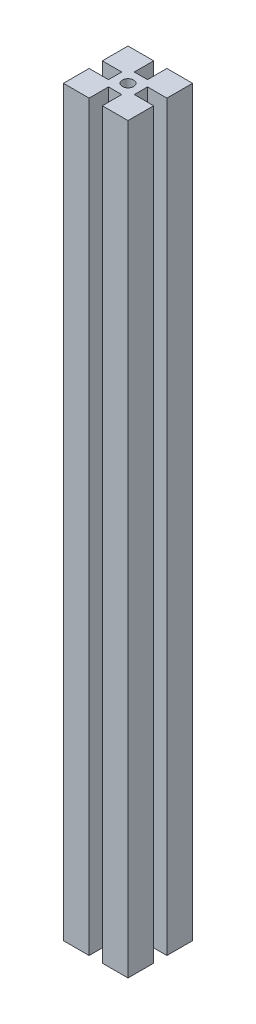
ISO-10303-21;
HEADER;
FILE_DESCRIPTION(('STEP AP214'),'2;1');
FILE_NAME('part.step','',(''),(''),'','','');
FILE_SCHEMA(('AUTOMOTIVE_DESIGN { 1 0 10303 214 1 1 1 1 }'));
ENDSEC;
DATA;
#1=APPLICATION_CONTEXT('core data for automotive mechanical design processes');
#2=APPLICATION_PROTOCOL_DEFINITION('international standard','automotive_design',2000,#1);
#3=PRODUCT_CONTEXT('',#1,'mechanical');
#4=PRODUCT('Part','Part','',(#3));
#5=PRODUCT_RELATED_PRODUCT_CATEGORY('part','',(#4));
#6=PRODUCT_DEFINITION_FORMATION('','',#4);
#7=PRODUCT_DEFINITION_CONTEXT('part definition',#1,'design');
#8=PRODUCT_DEFINITION('design','',#6,#7);
#9=PRODUCT_DEFINITION_SHAPE('','',#8);
#10=(LENGTH_UNIT() NAMED_UNIT(*) SI_UNIT(.MILLI.,.METRE.));
#11=(NAMED_UNIT(*) PLANE_ANGLE_UNIT() SI_UNIT($,.RADIAN.));
#12=(NAMED_UNIT(*) SI_UNIT($,.STERADIAN.) SOLID_ANGLE_UNIT());
#13=UNCERTAINTY_MEASURE_WITH_UNIT(LENGTH_MEASURE(1.E-05),#10,'distance_accuracy_value','');
#14=(GEOMETRIC_REPRESENTATION_CONTEXT(3) GLOBAL_UNCERTAINTY_ASSIGNED_CONTEXT((#13)) GLOBAL_UNIT_ASSIGNED_CONTEXT((#10,
#11,#12)) REPRESENTATION_CONTEXT('',''));
#15=CARTESIAN_POINT('',(0.,0.,0.));
#16=DIRECTION('',(0.,0.,1.));
#17=DIRECTION('',(1.,0.,0.));
#18=AXIS2_PLACEMENT_3D('',#15,#16,#17);
#19=CARTESIAN_POINT('',(20.,-230.,4.1));
#20=DIRECTION('',(1.,0.,0.));
#21=DIRECTION('',(0.,0.,-1.));
#22=AXIS2_PLACEMENT_3D('',#19,#20,#21);
#23=PLANE('',#22);
#24=DIRECTION('',(0.,1.,0.));
#25=VECTOR('',#24,1.);
#26=CARTESIAN_POINT('',(20.,-230.,4.1));
#27=LINE('',#26,#25);
#28=CARTESIAN_POINT('',(20.,-230.,4.1));
#29=VERTEX_POINT('',#28);
#30=CARTESIAN_POINT('',(20.,230.,4.1));
#31=VERTEX_POINT('',#30);
#32=EDGE_CURVE('E36',#29,#31,#27,.T.);
#33=ORIENTED_EDGE('',*,*,#32,.T.);
#34=DIRECTION('',(0.,0.,-1.));
#35=VECTOR('',#34,1.);
#36=CARTESIAN_POINT('',(20.,230.,4.1));
#37=LINE('',#36,#35);
#38=CARTESIAN_POINT('',(20.,230.,20.));
#39=VERTEX_POINT('',#38);
#40=EDGE_CURVE('E169',#39,#31,#37,.T.);
#41=ORIENTED_EDGE('',*,*,#40,.F.);
#42=DIRECTION('',(0.,1.,0.));
#43=VECTOR('',#42,1.);
#44=CARTESIAN_POINT('',(20.,-230.,20.));
#45=LINE('',#44,#43);
#46=CARTESIAN_POINT('',(20.,-230.,20.));
#47=VERTEX_POINT('',#46);
#48=EDGE_CURVE('E11',#47,#39,#45,.T.);
#49=ORIENTED_EDGE('',*,*,#48,.F.);
#50=DIRECTION('',(0.,0.,-1.));
#51=VECTOR('',#50,1.);
#52=CARTESIAN_POINT('',(20.,-230.,4.1));
#53=LINE('',#52,#51);
#54=EDGE_CURVE('E170',#47,#29,#53,.T.);
#55=ORIENTED_EDGE('',*,*,#54,.T.);
#56=EDGE_LOOP('',(#33,#41,#49,#55));
#57=FACE_BOUND('',#56,.T.);
#58=ADVANCED_FACE('F33',(#57),#23,.T.);
#59=CARTESIAN_POINT('',(4.10000000000001,-230.,20.));
#60=DIRECTION('',(0.,0.,1.));
#61=DIRECTION('',(1.,0.,0.));
#62=AXIS2_PLACEMENT_3D('',#59,#60,#61);
#63=PLANE('',#62);
#64=ORIENTED_EDGE('',*,*,#48,.T.);
#65=DIRECTION('',(1.,0.,0.));
#66=VECTOR('',#65,1.);
#67=CARTESIAN_POINT('',(4.10000000000001,230.,20.));
#68=LINE('',#67,#66);
#69=CARTESIAN_POINT('',(4.10000000000001,230.,20.));
#70=VERTEX_POINT('',#69);
#71=EDGE_CURVE('E188',#70,#39,#68,.T.);
#72=ORIENTED_EDGE('',*,*,#71,.F.);
#73=DIRECTION('',(0.,1.,0.));
#74=VECTOR('',#73,1.);
#75=CARTESIAN_POINT('',(4.10000000000001,-230.,20.));
#76=LINE('',#75,#74);
#77=CARTESIAN_POINT('',(4.10000000000001,-230.,20.));
#78=VERTEX_POINT('',#77);
#79=EDGE_CURVE('E41',#78,#70,#76,.T.);
#80=ORIENTED_EDGE('',*,*,#79,.F.);
#81=DIRECTION('',(1.,0.,0.));
#82=VECTOR('',#81,1.);
#83=CARTESIAN_POINT('',(4.10000000000001,-230.,20.));
#84=LINE('',#83,#82);
#85=EDGE_CURVE('E175',#78,#47,#84,.T.);
#86=ORIENTED_EDGE('',*,*,#85,.T.);
#87=EDGE_LOOP('',(#64,#72,#80,#86));
#88=FACE_BOUND('',#87,.T.);
#89=ADVANCED_FACE('F402',(#88),#63,.T.);
#90=CARTESIAN_POINT('',(4.10000000000001,-230.,7.99999999999999));
#91=DIRECTION('',(-1.,0.,0.));
#92=DIRECTION('',(0.,0.,1.));
#93=AXIS2_PLACEMENT_3D('',#90,#91,#92);
#94=PLANE('',#93);
#95=ORIENTED_EDGE('',*,*,#79,.T.);
#96=DIRECTION('',(0.,0.,1.));
#97=VECTOR('',#96,1.);
#98=CARTESIAN_POINT('',(4.10000000000001,230.,7.99999999999999));
#99=LINE('',#98,#97);
#100=CARTESIAN_POINT('',(4.10000000000001,230.,7.99999999999999));
#101=VERTEX_POINT('',#100);
#102=EDGE_CURVE('E240',#101,#70,#99,.T.);
#103=ORIENTED_EDGE('',*,*,#102,.F.);
#104=DIRECTION('',(0.,1.,0.));
#105=VECTOR('',#104,1.);
#106=CARTESIAN_POINT('',(4.10000000000001,-230.,7.99999999999999));
#107=LINE('',#106,#105);
#108=CARTESIAN_POINT('',(4.10000000000001,-230.,7.99999999999999));
#109=VERTEX_POINT('',#108);
#110=EDGE_CURVE('E301',#109,#101,#107,.T.);
#111=ORIENTED_EDGE('',*,*,#110,.F.);
#112=DIRECTION('',(0.,0.,1.));
#113=VECTOR('',#112,1.);
#114=CARTESIAN_POINT('',(4.10000000000001,-230.,7.99999999999999));
#115=LINE('',#114,#113);
#116=EDGE_CURVE('E297',#109,#78,#115,.T.);
#117=ORIENTED_EDGE('',*,*,#116,.T.);
#118=EDGE_LOOP('',(#95,#103,#111,#117));
#119=FACE_BOUND('',#118,.T.);
#120=ADVANCED_FACE('F401',(#119),#94,.T.);
#121=CARTESIAN_POINT('',(-4.09999999999999,-230.,7.99999999999999));
#122=DIRECTION('',(0.,0.,1.));
#123=DIRECTION('',(1.,0.,0.));
#124=AXIS2_PLACEMENT_3D('',#121,#122,#123);
#125=PLANE('',#124);
#126=ORIENTED_EDGE('',*,*,#110,.T.);
#127=DIRECTION('',(1.,0.,0.));
#128=VECTOR('',#127,1.);
#129=CARTESIAN_POINT('',(-4.09999999999999,230.,7.99999999999999));
#130=LINE('',#129,#128);
#131=CARTESIAN_POINT('',(-4.09999999999999,230.,7.99999999999999));
#132=VERTEX_POINT('',#131);
#133=EDGE_CURVE('E237',#132,#101,#130,.T.);
#134=ORIENTED_EDGE('',*,*,#133,.F.);
#135=DIRECTION('',(0.,1.,0.));
#136=VECTOR('',#135,1.);
#137=CARTESIAN_POINT('',(-4.09999999999999,-230.,7.99999999999999));
#138=LINE('',#137,#136);
#139=CARTESIAN_POINT('',(-4.09999999999999,-230.,7.99999999999999));
#140=VERTEX_POINT('',#139);
#141=EDGE_CURVE('E303',#140,#132,#138,.T.);
#142=ORIENTED_EDGE('',*,*,#141,.F.);
#143=DIRECTION('',(1.,0.,0.));
#144=VECTOR('',#143,1.);
#145=CARTESIAN_POINT('',(-4.09999999999999,-230.,7.99999999999999));
#146=LINE('',#145,#144);
#147=EDGE_CURVE('E294',#140,#109,#146,.T.);
#148=ORIENTED_EDGE('',*,*,#147,.T.);
#149=EDGE_LOOP('',(#126,#134,#142,#148));
#150=FACE_BOUND('',#149,.T.);
#151=ADVANCED_FACE('F397',(#150),#125,.T.);
#152=CARTESIAN_POINT('',(-4.09999999999999,-230.,20.));
#153=DIRECTION('',(1.,0.,0.));
#154=DIRECTION('',(0.,0.,-1.));
#155=AXIS2_PLACEMENT_3D('',#152,#153,#154);
#156=PLANE('',#155);
#157=ORIENTED_EDGE('',*,*,#141,.T.);
#158=DIRECTION('',(0.,0.,-1.));
#159=VECTOR('',#158,1.);
#160=CARTESIAN_POINT('',(-4.09999999999999,230.,20.));
#161=LINE('',#160,#159);
#162=CARTESIAN_POINT('',(-4.09999999999999,230.,20.));
#163=VERTEX_POINT('',#162);
#164=EDGE_CURVE('E234',#163,#132,#161,.T.);
#165=ORIENTED_EDGE('',*,*,#164,.F.);
#166=DIRECTION('',(0.,1.,0.));
#167=VECTOR('',#166,1.);
#168=CARTESIAN_POINT('',(-4.09999999999999,-230.,20.));
#169=LINE('',#168,#167);
#170=CARTESIAN_POINT('',(-4.09999999999999,-230.,20.));
#171=VERTEX_POINT('',#170);
#172=EDGE_CURVE('E305',#171,#163,#169,.T.);
#173=ORIENTED_EDGE('',*,*,#172,.F.);
#174=DIRECTION('',(0.,0.,-1.));
#175=VECTOR('',#174,1.);
#176=CARTESIAN_POINT('',(-4.09999999999999,-230.,20.));
#177=LINE('',#176,#175);
#178=EDGE_CURVE('E291',#171,#140,#177,.T.);
#179=ORIENTED_EDGE('',*,*,#178,.T.);
#180=EDGE_LOOP('',(#157,#165,#173,#179));
#181=FACE_BOUND('',#180,.T.);
#182=ADVANCED_FACE('F392',(#181),#156,.T.);
#183=CARTESIAN_POINT('',(-20.,-230.,20.));
#184=DIRECTION('',(0.,0.,1.));
#185=DIRECTION('',(1.,0.,0.));
#186=AXIS2_PLACEMENT_3D('',#183,#184,#185);
#187=PLANE('',#186);
#188=ORIENTED_EDGE('',*,*,#172,.T.);
#189=DIRECTION('',(1.,0.,0.));
#190=VECTOR('',#189,1.);
#191=CARTESIAN_POINT('',(-20.,230.,20.));
#192=LINE('',#191,#190);
#193=CARTESIAN_POINT('',(-20.,230.,20.));
#194=VERTEX_POINT('',#193);
#195=EDGE_CURVE('E231',#194,#163,#192,.T.);
#196=ORIENTED_EDGE('',*,*,#195,.F.);
#197=DIRECTION('',(0.,1.,0.));
#198=VECTOR('',#197,1.);
#199=CARTESIAN_POINT('',(-20.,-230.,20.));
#200=LINE('',#199,#198);
#201=CARTESIAN_POINT('',(-20.,-230.,20.));
#202=VERTEX_POINT('',#201);
#203=EDGE_CURVE('E307',#202,#194,#200,.T.);
#204=ORIENTED_EDGE('',*,*,#203,.F.);
#205=DIRECTION('',(1.,0.,0.));
#206=VECTOR('',#205,1.);
#207=CARTESIAN_POINT('',(-20.,-230.,20.));
#208=LINE('',#207,#206);
#209=EDGE_CURVE('E288',#202,#171,#208,.T.);
#210=ORIENTED_EDGE('',*,*,#209,.T.);
#211=EDGE_LOOP('',(#188,#196,#204,#210));
#212=FACE_BOUND('',#211,.T.);
#213=ADVANCED_FACE('F390',(#212),#187,.T.);
#214=CARTESIAN_POINT('',(-20.,-230.,4.1));
#215=DIRECTION('',(-1.,0.,0.));
#216=DIRECTION('',(0.,0.,1.));
#217=AXIS2_PLACEMENT_3D('',#214,#215,#216);
#218=PLANE('',#217);
#219=ORIENTED_EDGE('',*,*,#203,.T.);
#220=DIRECTION('',(0.,0.,1.));
#221=VECTOR('',#220,1.);
#222=CARTESIAN_POINT('',(-20.,230.,4.1));
#223=LINE('',#222,#221);
#224=CARTESIAN_POINT('',(-20.,230.,4.1));
#225=VERTEX_POINT('',#224);
#226=EDGE_CURVE('E228',#225,#194,#223,.T.);
#227=ORIENTED_EDGE('',*,*,#226,.F.);
#228=DIRECTION('',(0.,1.,0.));
#229=VECTOR('',#228,1.);
#230=CARTESIAN_POINT('',(-20.,-230.,4.1));
#231=LINE('',#230,#229);
#232=CARTESIAN_POINT('',(-20.,-230.,4.1));
#233=VERTEX_POINT('',#232);
#234=EDGE_CURVE('E309',#233,#225,#231,.T.);
#235=ORIENTED_EDGE('',*,*,#234,.F.);
#236=DIRECTION('',(0.,0.,1.));
#237=VECTOR('',#236,1.);
#238=CARTESIAN_POINT('',(-20.,-230.,4.1));
#239=LINE('',#238,#237);
#240=EDGE_CURVE('E285',#233,#202,#239,.T.);
#241=ORIENTED_EDGE('',*,*,#240,.T.);
#242=EDGE_LOOP('',(#219,#227,#235,#241));
#243=FACE_BOUND('',#242,.T.);
#244=ADVANCED_FACE('F385',(#243),#218,.T.);
#245=CARTESIAN_POINT('',(-8.,-230.,4.1));
#246=DIRECTION('',(0.,0.,-1.));
#247=DIRECTION('',(-1.,0.,0.));
#248=AXIS2_PLACEMENT_3D('',#245,#246,#247);
#249=PLANE('',#248);
#250=ORIENTED_EDGE('',*,*,#234,.T.);
#251=DIRECTION('',(-1.,0.,0.));
#252=VECTOR('',#251,1.);
#253=CARTESIAN_POINT('',(-8.,230.,4.1));
#254=LINE('',#253,#252);
#255=CARTESIAN_POINT('',(-8.,230.,4.1));
#256=VERTEX_POINT('',#255);
#257=EDGE_CURVE('E225',#256,#225,#254,.T.);
#258=ORIENTED_EDGE('',*,*,#257,.F.);
#259=DIRECTION('',(0.,1.,0.));
#260=VECTOR('',#259,1.);
#261=CARTESIAN_POINT('',(-8.,-230.,4.1));
#262=LINE('',#261,#260);
#263=CARTESIAN_POINT('',(-8.,-230.,4.1));
#264=VERTEX_POINT('',#263);
#265=EDGE_CURVE('E311',#264,#256,#262,.T.);
#266=ORIENTED_EDGE('',*,*,#265,.F.);
#267=DIRECTION('',(-1.,0.,0.));
#268=VECTOR('',#267,1.);
#269=CARTESIAN_POINT('',(-8.,-230.,4.1));
#270=LINE('',#269,#268);
#271=EDGE_CURVE('E282',#264,#233,#270,.T.);
#272=ORIENTED_EDGE('',*,*,#271,.T.);
#273=EDGE_LOOP('',(#250,#258,#266,#272));
#274=FACE_BOUND('',#273,.T.);
#275=ADVANCED_FACE('F380',(#274),#249,.T.);
#276=CARTESIAN_POINT('',(-8.,-230.,-4.1));
#277=DIRECTION('',(-1.,0.,0.));
#278=DIRECTION('',(0.,0.,1.));
#279=AXIS2_PLACEMENT_3D('',#276,#277,#278);
#280=PLANE('',#279);
#281=ORIENTED_EDGE('',*,*,#265,.T.);
#282=DIRECTION('',(0.,0.,1.));
#283=VECTOR('',#282,1.);
#284=CARTESIAN_POINT('',(-8.,230.,-4.1));
#285=LINE('',#284,#283);
#286=CARTESIAN_POINT('',(-8.,230.,-4.1));
#287=VERTEX_POINT('',#286);
#288=EDGE_CURVE('E222',#287,#256,#285,.T.);
#289=ORIENTED_EDGE('',*,*,#288,.F.);
#290=DIRECTION('',(0.,1.,0.));
#291=VECTOR('',#290,1.);
#292=CARTESIAN_POINT('',(-8.,-230.,-4.1));
#293=LINE('',#292,#291);
#294=CARTESIAN_POINT('',(-8.,-230.,-4.1));
#295=VERTEX_POINT('',#294);
#296=EDGE_CURVE('E313',#295,#287,#293,.T.);
#297=ORIENTED_EDGE('',*,*,#296,.F.);
#298=DIRECTION('',(0.,0.,1.));
#299=VECTOR('',#298,1.);
#300=CARTESIAN_POINT('',(-8.,-230.,-4.1));
#301=LINE('',#300,#299);
#302=EDGE_CURVE('E279',#295,#264,#301,.T.);
#303=ORIENTED_EDGE('',*,*,#302,.T.);
#304=EDGE_LOOP('',(#281,#289,#297,#303));
#305=FACE_BOUND('',#304,.T.);
#306=ADVANCED_FACE('F378',(#305),#280,.T.);
#307=CARTESIAN_POINT('',(-20.,-230.,-4.1));
#308=DIRECTION('',(0.,0.,1.));
#309=DIRECTION('',(1.,0.,0.));
#310=AXIS2_PLACEMENT_3D('',#307,#308,#309);
#311=PLANE('',#310);
#312=ORIENTED_EDGE('',*,*,#296,.T.);
#313=DIRECTION('',(1.,0.,0.));
#314=VECTOR('',#313,1.);
#315=CARTESIAN_POINT('',(-20.,230.,-4.1));
#316=LINE('',#315,#314);
#317=CARTESIAN_POINT('',(-20.,230.,-4.1));
#318=VERTEX_POINT('',#317);
#319=EDGE_CURVE('E219',#318,#287,#316,.T.);
#320=ORIENTED_EDGE('',*,*,#319,.F.);
#321=DIRECTION('',(0.,1.,0.));
#322=VECTOR('',#321,1.);
#323=CARTESIAN_POINT('',(-20.,-230.,-4.1));
#324=LINE('',#323,#322);
#325=CARTESIAN_POINT('',(-20.,-230.,-4.1));
#326=VERTEX_POINT('',#325);
#327=EDGE_CURVE('E315',#326,#318,#324,.T.);
#328=ORIENTED_EDGE('',*,*,#327,.F.);
#329=DIRECTION('',(1.,0.,0.));
#330=VECTOR('',#329,1.);
#331=CARTESIAN_POINT('',(-20.,-230.,-4.1));
#332=LINE('',#331,#330);
#333=EDGE_CURVE('E276',#326,#295,#332,.T.);
#334=ORIENTED_EDGE('',*,*,#333,.T.);
#335=EDGE_LOOP('',(#312,#320,#328,#334));
#336=FACE_BOUND('',#335,.T.);
#337=ADVANCED_FACE('F373',(#336),#311,.T.);
#338=CARTESIAN_POINT('',(-20.,-230.,-20.));
#339=DIRECTION('',(-1.,0.,0.));
#340=DIRECTION('',(0.,0.,1.));
#341=AXIS2_PLACEMENT_3D('',#338,#339,#340);
#342=PLANE('',#341);
#343=ORIENTED_EDGE('',*,*,#327,.T.);
#344=DIRECTION('',(0.,0.,1.));
#345=VECTOR('',#344,1.);
#346=CARTESIAN_POINT('',(-20.,230.,-20.));
#347=LINE('',#346,#345);
#348=CARTESIAN_POINT('',(-20.,230.,-20.));
#349=VERTEX_POINT('',#348);
#350=EDGE_CURVE('E216',#349,#318,#347,.T.);
#351=ORIENTED_EDGE('',*,*,#350,.F.);
#352=DIRECTION('',(0.,1.,0.));
#353=VECTOR('',#352,1.);
#354=CARTESIAN_POINT('',(-20.,-230.,-20.));
#355=LINE('',#354,#353);
#356=CARTESIAN_POINT('',(-20.,-230.,-20.));
#357=VERTEX_POINT('',#356);
#358=EDGE_CURVE('E317',#357,#349,#355,.T.);
#359=ORIENTED_EDGE('',*,*,#358,.F.);
#360=DIRECTION('',(0.,0.,1.));
#361=VECTOR('',#360,1.);
#362=CARTESIAN_POINT('',(-20.,-230.,-20.));
#363=LINE('',#362,#361);
#364=EDGE_CURVE('E273',#357,#326,#363,.T.);
#365=ORIENTED_EDGE('',*,*,#364,.T.);
#366=EDGE_LOOP('',(#343,#351,#359,#365));
#367=FACE_BOUND('',#366,.T.);
#368=ADVANCED_FACE('F368',(#367),#342,.T.);
#369=CARTESIAN_POINT('',(-20.,-230.,-20.));
#370=DIRECTION('',(0.,0.,-1.));
#371=DIRECTION('',(-1.,0.,0.));
#372=AXIS2_PLACEMENT_3D('',#369,#370,#371);
#373=PLANE('',#372);
#374=ORIENTED_EDGE('',*,*,#358,.T.);
#375=DIRECTION('',(-1.,0.,0.));
#376=VECTOR('',#375,1.);
#377=CARTESIAN_POINT('',(-20.,230.,-20.));
#378=LINE('',#377,#376);
#379=CARTESIAN_POINT('',(-4.09999999999999,230.,-20.));
#380=VERTEX_POINT('',#379);
#381=EDGE_CURVE('E213',#380,#349,#378,.T.);
#382=ORIENTED_EDGE('',*,*,#381,.F.);
#383=DIRECTION('',(0.,1.,0.));
#384=VECTOR('',#383,1.);
#385=CARTESIAN_POINT('',(-4.09999999999999,-230.,-20.));
#386=LINE('',#385,#384);
#387=CARTESIAN_POINT('',(-4.09999999999999,-230.,-20.));
#388=VERTEX_POINT('',#387);
#389=EDGE_CURVE('E319',#388,#380,#386,.T.);
#390=ORIENTED_EDGE('',*,*,#389,.F.);
#391=DIRECTION('',(-1.,0.,0.));
#392=VECTOR('',#391,1.);
#393=CARTESIAN_POINT('',(-20.,-230.,-20.));
#394=LINE('',#393,#392);
#395=EDGE_CURVE('E270',#388,#357,#394,.T.);
#396=ORIENTED_EDGE('',*,*,#395,.T.);
#397=EDGE_LOOP('',(#374,#382,#390,#396));
#398=FACE_BOUND('',#397,.T.);
#399=ADVANCED_FACE('F366',(#398),#373,.T.);
#400=CARTESIAN_POINT('',(-4.09999999999999,-230.,-20.));
#401=DIRECTION('',(1.,0.,0.));
#402=DIRECTION('',(0.,0.,-1.));
#403=AXIS2_PLACEMENT_3D('',#400,#401,#402);
#404=PLANE('',#403);
#405=ORIENTED_EDGE('',*,*,#389,.T.);
#406=DIRECTION('',(0.,0.,-1.));
#407=VECTOR('',#406,1.);
#408=CARTESIAN_POINT('',(-4.09999999999999,230.,-20.));
#409=LINE('',#408,#407);
#410=CARTESIAN_POINT('',(-4.09999999999999,230.,-7.99999999999999));
#411=VERTEX_POINT('',#410);
#412=EDGE_CURVE('E210',#411,#380,#409,.T.);
#413=ORIENTED_EDGE('',*,*,#412,.F.);
#414=DIRECTION('',(0.,1.,0.));
#415=VECTOR('',#414,1.);
#416=CARTESIAN_POINT('',(-4.09999999999999,-230.,-7.99999999999999));
#417=LINE('',#416,#415);
#418=CARTESIAN_POINT('',(-4.09999999999999,-230.,-7.99999999999999));
#419=VERTEX_POINT('',#418);
#420=EDGE_CURVE('E321',#419,#411,#417,.T.);
#421=ORIENTED_EDGE('',*,*,#420,.F.);
#422=DIRECTION('',(0.,0.,-1.));
#423=VECTOR('',#422,1.);
#424=CARTESIAN_POINT('',(-4.09999999999999,-230.,-20.));
#425=LINE('',#424,#423);
#426=EDGE_CURVE('E267',#419,#388,#425,.T.);
#427=ORIENTED_EDGE('',*,*,#426,.T.);
#428=EDGE_LOOP('',(#405,#413,#421,#427));
#429=FACE_BOUND('',#428,.T.);
#430=ADVANCED_FACE('F361',(#429),#404,.T.);
#431=CARTESIAN_POINT('',(-4.09999999999999,-230.,-7.99999999999999));
#432=DIRECTION('',(0.,0.,-1.));
#433=DIRECTION('',(-1.,0.,0.));
#434=AXIS2_PLACEMENT_3D('',#431,#432,#433);
#435=PLANE('',#434);
#436=ORIENTED_EDGE('',*,*,#420,.T.);
#437=DIRECTION('',(-1.,0.,0.));
#438=VECTOR('',#437,1.);
#439=CARTESIAN_POINT('',(-4.09999999999999,230.,-7.99999999999999));
#440=LINE('',#439,#438);
#441=CARTESIAN_POINT('',(4.10000000000001,230.,-7.99999999999999));
#442=VERTEX_POINT('',#441);
#443=EDGE_CURVE('E207',#442,#411,#440,.T.);
#444=ORIENTED_EDGE('',*,*,#443,.F.);
#445=DIRECTION('',(0.,1.,0.));
#446=VECTOR('',#445,1.);
#447=CARTESIAN_POINT('',(4.10000000000001,-230.,-7.99999999999999));
#448=LINE('',#447,#446);
#449=CARTESIAN_POINT('',(4.10000000000001,-230.,-7.99999999999999));
#450=VERTEX_POINT('',#449);
#451=EDGE_CURVE('E323',#450,#442,#448,.T.);
#452=ORIENTED_EDGE('',*,*,#451,.F.);
#453=DIRECTION('',(-1.,0.,0.));
#454=VECTOR('',#453,1.);
#455=CARTESIAN_POINT('',(-4.09999999999999,-230.,-7.99999999999999));
#456=LINE('',#455,#454);
#457=EDGE_CURVE('E264',#450,#419,#456,.T.);
#458=ORIENTED_EDGE('',*,*,#457,.T.);
#459=EDGE_LOOP('',(#436,#444,#452,#458));
#460=FACE_BOUND('',#459,.T.);
#461=ADVANCED_FACE('F356',(#460),#435,.T.);
#462=CARTESIAN_POINT('',(4.10000000000001,-230.,-7.99999999999999));
#463=DIRECTION('',(-1.,0.,0.));
#464=DIRECTION('',(0.,0.,1.));
#465=AXIS2_PLACEMENT_3D('',#462,#463,#464);
#466=PLANE('',#465);
#467=ORIENTED_EDGE('',*,*,#451,.T.);
#468=DIRECTION('',(0.,0.,1.));
#469=VECTOR('',#468,1.);
#470=CARTESIAN_POINT('',(4.10000000000001,230.,-7.99999999999999));
#471=LINE('',#470,#469);
#472=CARTESIAN_POINT('',(4.10000000000001,230.,-20.));
#473=VERTEX_POINT('',#472);
#474=EDGE_CURVE('E204',#473,#442,#471,.T.);
#475=ORIENTED_EDGE('',*,*,#474,.F.);
#476=DIRECTION('',(0.,1.,0.));
#477=VECTOR('',#476,1.);
#478=CARTESIAN_POINT('',(4.10000000000001,-230.,-20.));
#479=LINE('',#478,#477);
#480=CARTESIAN_POINT('',(4.10000000000001,-230.,-20.));
#481=VERTEX_POINT('',#480);
#482=EDGE_CURVE('E325',#481,#473,#479,.T.);
#483=ORIENTED_EDGE('',*,*,#482,.F.);
#484=DIRECTION('',(0.,0.,1.));
#485=VECTOR('',#484,1.);
#486=CARTESIAN_POINT('',(4.10000000000001,-230.,-7.99999999999999));
#487=LINE('',#486,#485);
#488=EDGE_CURVE('E261',#481,#450,#487,.T.);
#489=ORIENTED_EDGE('',*,*,#488,.T.);
#490=EDGE_LOOP('',(#467,#475,#483,#489));
#491=FACE_BOUND('',#490,.T.);
#492=ADVANCED_FACE('F354',(#491),#466,.T.);
#493=CARTESIAN_POINT('',(4.10000000000001,-230.,-20.));
#494=DIRECTION('',(0.,0.,-1.));
#495=DIRECTION('',(-1.,0.,0.));
#496=AXIS2_PLACEMENT_3D('',#493,#494,#495);
#497=PLANE('',#496);
#498=ORIENTED_EDGE('',*,*,#482,.T.);
#499=DIRECTION('',(-1.,0.,0.));
#500=VECTOR('',#499,1.);
#501=CARTESIAN_POINT('',(4.10000000000001,230.,-20.));
#502=LINE('',#501,#500);
#503=CARTESIAN_POINT('',(20.,230.,-20.));
#504=VERTEX_POINT('',#503);
#505=EDGE_CURVE('E201',#504,#473,#502,.T.);
#506=ORIENTED_EDGE('',*,*,#505,.F.);
#507=DIRECTION('',(0.,1.,0.));
#508=VECTOR('',#507,1.);
#509=CARTESIAN_POINT('',(20.,-230.,-20.));
#510=LINE('',#509,#508);
#511=CARTESIAN_POINT('',(20.,-230.,-20.));
#512=VERTEX_POINT('',#511);
#513=EDGE_CURVE('E327',#512,#504,#510,.T.);
#514=ORIENTED_EDGE('',*,*,#513,.F.);
#515=DIRECTION('',(-1.,0.,0.));
#516=VECTOR('',#515,1.);
#517=CARTESIAN_POINT('',(4.10000000000001,-230.,-20.));
#518=LINE('',#517,#516);
#519=EDGE_CURVE('E258',#512,#481,#518,.T.);
#520=ORIENTED_EDGE('',*,*,#519,.T.);
#521=EDGE_LOOP('',(#498,#506,#514,#520));
#522=FACE_BOUND('',#521,.T.);
#523=ADVANCED_FACE('F349',(#522),#497,.T.);
#524=CARTESIAN_POINT('',(20.,-230.,-20.));
#525=DIRECTION('',(1.,0.,0.));
#526=DIRECTION('',(0.,0.,-1.));
#527=AXIS2_PLACEMENT_3D('',#524,#525,#526);
#528=PLANE('',#527);
#529=ORIENTED_EDGE('',*,*,#513,.T.);
#530=DIRECTION('',(0.,0.,-1.));
#531=VECTOR('',#530,1.);
#532=CARTESIAN_POINT('',(20.,230.,-20.));
#533=LINE('',#532,#531);
#534=CARTESIAN_POINT('',(20.,230.,-4.1));
#535=VERTEX_POINT('',#534);
#536=EDGE_CURVE('E198',#535,#504,#533,.T.);
#537=ORIENTED_EDGE('',*,*,#536,.F.);
#538=DIRECTION('',(0.,1.,0.));
#539=VECTOR('',#538,1.);
#540=CARTESIAN_POINT('',(20.,-230.,-4.1));
#541=LINE('',#540,#539);
#542=CARTESIAN_POINT('',(20.,-230.,-4.1));
#543=VERTEX_POINT('',#542);
#544=EDGE_CURVE('E329',#543,#535,#541,.T.);
#545=ORIENTED_EDGE('',*,*,#544,.F.);
#546=DIRECTION('',(0.,0.,-1.));
#547=VECTOR('',#546,1.);
#548=CARTESIAN_POINT('',(20.,-230.,-20.));
#549=LINE('',#548,#547);
#550=EDGE_CURVE('E255',#543,#512,#549,.T.);
#551=ORIENTED_EDGE('',*,*,#550,.T.);
#552=EDGE_LOOP('',(#529,#537,#545,#551));
#553=FACE_BOUND('',#552,.T.);
#554=ADVANCED_FACE('F342',(#553),#528,.T.);
#555=CARTESIAN_POINT('',(20.,-230.,-4.1));
#556=DIRECTION('',(0.,0.,1.));
#557=DIRECTION('',(1.,0.,0.));
#558=AXIS2_PLACEMENT_3D('',#555,#556,#557);
#559=PLANE('',#558);
#560=ORIENTED_EDGE('',*,*,#544,.T.);
#561=DIRECTION('',(1.,0.,0.));
#562=VECTOR('',#561,1.);
#563=CARTESIAN_POINT('',(20.,230.,-4.1));
#564=LINE('',#563,#562);
#565=CARTESIAN_POINT('',(8.,230.,-4.1));
#566=VERTEX_POINT('',#565);
#567=EDGE_CURVE('E195',#566,#535,#564,.T.);
#568=ORIENTED_EDGE('',*,*,#567,.F.);
#569=DIRECTION('',(0.,1.,0.));
#570=VECTOR('',#569,1.);
#571=CARTESIAN_POINT('',(8.,-230.,-4.1));
#572=LINE('',#571,#570);
#573=CARTESIAN_POINT('',(8.,-230.,-4.1));
#574=VERTEX_POINT('',#573);
#575=EDGE_CURVE('E331',#574,#566,#572,.T.);
#576=ORIENTED_EDGE('',*,*,#575,.F.);
#577=DIRECTION('',(1.,0.,0.));
#578=VECTOR('',#577,1.);
#579=CARTESIAN_POINT('',(20.,-230.,-4.1));
#580=LINE('',#579,#578);
#581=EDGE_CURVE('E252',#574,#543,#580,.T.);
#582=ORIENTED_EDGE('',*,*,#581,.T.);
#583=EDGE_LOOP('',(#560,#568,#576,#582));
#584=FACE_BOUND('',#583,.T.);
#585=ADVANCED_FACE('F339',(#584),#559,.T.);
#586=CARTESIAN_POINT('',(8.,-230.,-4.1));
#587=DIRECTION('',(1.,0.,0.));
#588=DIRECTION('',(0.,0.,-1.));
#589=AXIS2_PLACEMENT_3D('',#586,#587,#588);
#590=PLANE('',#589);
#591=ORIENTED_EDGE('',*,*,#575,.T.);
#592=DIRECTION('',(0.,0.,-1.));
#593=VECTOR('',#592,1.);
#594=CARTESIAN_POINT('',(8.,230.,-4.1));
#595=LINE('',#594,#593);
#596=CARTESIAN_POINT('',(8.,230.,4.1));
#597=VERTEX_POINT('',#596);
#598=EDGE_CURVE('E182',#597,#566,#595,.T.);
#599=ORIENTED_EDGE('',*,*,#598,.F.);
#600=DIRECTION('',(0.,1.,0.));
#601=VECTOR('',#600,1.);
#602=CARTESIAN_POINT('',(8.,-230.,4.1));
#603=LINE('',#602,#601);
#604=CARTESIAN_POINT('',(8.,-230.,4.1));
#605=VERTEX_POINT('',#604);
#606=EDGE_CURVE('E174',#605,#597,#603,.T.);
#607=ORIENTED_EDGE('',*,*,#606,.F.);
#608=DIRECTION('',(0.,0.,-1.));
#609=VECTOR('',#608,1.);
#610=CARTESIAN_POINT('',(8.,-230.,-4.1));
#611=LINE('',#610,#609);
#612=EDGE_CURVE('E249',#605,#574,#611,.T.);
#613=ORIENTED_EDGE('',*,*,#612,.T.);
#614=EDGE_LOOP('',(#591,#599,#607,#613));
#615=FACE_BOUND('',#614,.T.);
#616=ADVANCED_FACE('F333',(#615),#590,.T.);
#617=CARTESIAN_POINT('',(8.,-230.,4.1));
#618=DIRECTION('',(0.,0.,-1.));
#619=DIRECTION('',(-1.,0.,0.));
#620=AXIS2_PLACEMENT_3D('',#617,#618,#619);
#621=PLANE('',#620);
#622=ORIENTED_EDGE('',*,*,#606,.T.);
#623=DIRECTION('',(-1.,0.,0.));
#624=VECTOR('',#623,1.);
#625=CARTESIAN_POINT('',(8.,230.,4.1));
#626=LINE('',#625,#624);
#627=EDGE_CURVE('E177',#31,#597,#626,.T.);
#628=ORIENTED_EDGE('',*,*,#627,.F.);
#629=ORIENTED_EDGE('',*,*,#32,.F.);
#630=DIRECTION('',(-1.,0.,0.));
#631=VECTOR('',#630,1.);
#632=CARTESIAN_POINT('',(8.,-230.,4.1));
#633=LINE('',#632,#631);
#634=EDGE_CURVE('E247',#29,#605,#633,.T.);
#635=ORIENTED_EDGE('',*,*,#634,.T.);
#636=EDGE_LOOP('',(#622,#628,#629,#635));
#637=FACE_BOUND('',#636,.T.);
#638=ADVANCED_FACE('F178',(#637),#621,.T.);
#639=CARTESIAN_POINT('',(0.,-230.,0.));
#640=DIRECTION('',(0.,1.,0.));
#641=DIRECTION('',(0.,0.,1.));
#642=AXIS2_PLACEMENT_3D('',#639,#640,#641);
#643=PLANE('',#642);
#644=CARTESIAN_POINT('',(0.,-230.,0.));
#645=DIRECTION('',(0.,1.,0.));
#646=DIRECTION('',(0.,0.,1.));
#647=AXIS2_PLACEMENT_3D('',#644,#645,#646);
#648=CIRCLE('',#647,3.5);
#649=CARTESIAN_POINT('',(0.,-230.,3.49999999999999));
#650=VERTEX_POINT('',#649);
#651=EDGE_CURVE('E243',#650,#650,#648,.T.);
#652=ORIENTED_EDGE('',*,*,#651,.T.);
#653=EDGE_LOOP('',(#652));
#654=FACE_BOUND('',#653,.T.);
#655=ORIENTED_EDGE('',*,*,#54,.F.);
#656=ORIENTED_EDGE('',*,*,#85,.F.);
#657=ORIENTED_EDGE('',*,*,#116,.F.);
#658=ORIENTED_EDGE('',*,*,#147,.F.);
#659=ORIENTED_EDGE('',*,*,#178,.F.);
#660=ORIENTED_EDGE('',*,*,#209,.F.);
#661=ORIENTED_EDGE('',*,*,#240,.F.);
#662=ORIENTED_EDGE('',*,*,#271,.F.);
#663=ORIENTED_EDGE('',*,*,#302,.F.);
#664=ORIENTED_EDGE('',*,*,#333,.F.);
#665=ORIENTED_EDGE('',*,*,#364,.F.);
#666=ORIENTED_EDGE('',*,*,#395,.F.);
#667=ORIENTED_EDGE('',*,*,#426,.F.);
#668=ORIENTED_EDGE('',*,*,#457,.F.);
#669=ORIENTED_EDGE('',*,*,#488,.F.);
#670=ORIENTED_EDGE('',*,*,#519,.F.);
#671=ORIENTED_EDGE('',*,*,#550,.F.);
#672=ORIENTED_EDGE('',*,*,#581,.F.);
#673=ORIENTED_EDGE('',*,*,#612,.F.);
#674=ORIENTED_EDGE('',*,*,#634,.F.);
#675=EDGE_LOOP('',(#655,#656,#657,#658,#659,#660,#661,#662,#663,#664,#665,#666,#667,#668,#669,
#670,#671,#672,#673,#674));
#676=FACE_BOUND('',#675,.T.);
#677=ADVANCED_FACE('F345',(#654,#676),#643,.F.);
#678=CARTESIAN_POINT('',(0.,-230.,0.));
#679=DIRECTION('',(0.,1.,0.));
#680=DIRECTION('',(0.,0.,1.));
#681=AXIS2_PLACEMENT_3D('',#678,#679,#680);
#682=CYLINDRICAL_SURFACE('',#681,3.5);
#683=ORIENTED_EDGE('',*,*,#651,.F.);
#684=EDGE_LOOP('',(#683));
#685=FACE_BOUND('',#684,.T.);
#686=CARTESIAN_POINT('',(0.,230.,0.));
#687=DIRECTION('',(0.,1.,0.));
#688=DIRECTION('',(0.,0.,1.));
#689=AXIS2_PLACEMENT_3D('',#686,#687,#688);
#690=CIRCLE('',#689,3.5);
#691=CARTESIAN_POINT('',(0.,230.,3.49999999999999));
#692=VERTEX_POINT('',#691);
#693=EDGE_CURVE('E189',#692,#692,#690,.T.);
#694=ORIENTED_EDGE('',*,*,#693,.T.);
#695=EDGE_LOOP('',(#694));
#696=FACE_BOUND('',#695,.T.);
#697=ADVANCED_FACE('F448',(#685,#696),#682,.F.);
#698=CARTESIAN_POINT('',(0.,230.,0.));
#699=DIRECTION('',(0.,1.,0.));
#700=DIRECTION('',(0.,0.,1.));
#701=AXIS2_PLACEMENT_3D('',#698,#699,#700);
#702=PLANE('',#701);
#703=ORIENTED_EDGE('',*,*,#40,.T.);
#704=ORIENTED_EDGE('',*,*,#627,.T.);
#705=ORIENTED_EDGE('',*,*,#598,.T.);
#706=ORIENTED_EDGE('',*,*,#567,.T.);
#707=ORIENTED_EDGE('',*,*,#536,.T.);
#708=ORIENTED_EDGE('',*,*,#505,.T.);
#709=ORIENTED_EDGE('',*,*,#474,.T.);
#710=ORIENTED_EDGE('',*,*,#443,.T.);
#711=ORIENTED_EDGE('',*,*,#412,.T.);
#712=ORIENTED_EDGE('',*,*,#381,.T.);
#713=ORIENTED_EDGE('',*,*,#350,.T.);
#714=ORIENTED_EDGE('',*,*,#319,.T.);
#715=ORIENTED_EDGE('',*,*,#288,.T.);
#716=ORIENTED_EDGE('',*,*,#257,.T.);
#717=ORIENTED_EDGE('',*,*,#226,.T.);
#718=ORIENTED_EDGE('',*,*,#195,.T.);
#719=ORIENTED_EDGE('',*,*,#164,.T.);
#720=ORIENTED_EDGE('',*,*,#133,.T.);
#721=ORIENTED_EDGE('',*,*,#102,.T.);
#722=ORIENTED_EDGE('',*,*,#71,.T.);
#723=EDGE_LOOP('',(#703,#704,#705,#706,#707,#708,#709,#710,#711,#712,#713,#714,#715,#716,#717,
#718,#719,#720,#721,#722));
#724=FACE_BOUND('',#723,.T.);
#725=ORIENTED_EDGE('',*,*,#693,.F.);
#726=EDGE_LOOP('',(#725));
#727=FACE_BOUND('',#726,.T.);
#728=ADVANCED_FACE('F185',(#724,#727),#702,.T.);
#729=CLOSED_SHELL('',(#58,#89,#120,#151,#182,#213,#244,#275,#306,#337,#368,#399,#430,#461,#492,
#523,#554,#585,#616,#638,#677,#697,#728));
#730=MANIFOLD_SOLID_BREP('B2',#729);
#731=ADVANCED_BREP_SHAPE_REPRESENTATION('',(#18,#730),#14);
#732=SHAPE_DEFINITION_REPRESENTATION(#9,#731);
ENDSEC;
END-ISO-10303-21;
